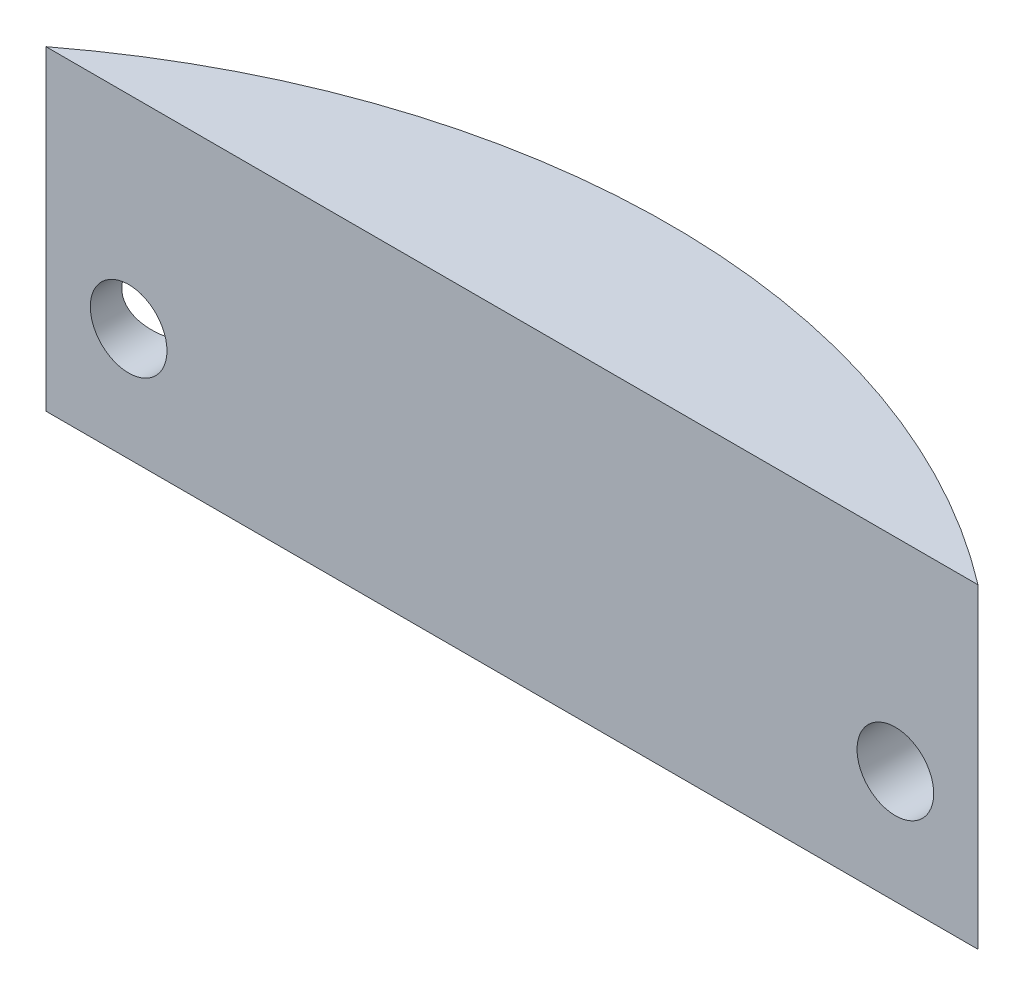
ISO-10303-21;
HEADER;
FILE_DESCRIPTION(('STEP AP214'),'2;1');
FILE_NAME('part.step','',(''),(''),'','','');
FILE_SCHEMA(('AUTOMOTIVE_DESIGN { 1 0 10303 214 1 1 1 1 }'));
ENDSEC;
DATA;
#1=APPLICATION_CONTEXT('core data for automotive mechanical design processes');
#2=APPLICATION_PROTOCOL_DEFINITION('international standard','automotive_design',2000,#1);
#3=PRODUCT_CONTEXT('',#1,'mechanical');
#4=PRODUCT('Part','Part','',(#3));
#5=PRODUCT_RELATED_PRODUCT_CATEGORY('part','',(#4));
#6=PRODUCT_DEFINITION_FORMATION('','',#4);
#7=PRODUCT_DEFINITION_CONTEXT('part definition',#1,'design');
#8=PRODUCT_DEFINITION('design','',#6,#7);
#9=PRODUCT_DEFINITION_SHAPE('','',#8);
#10=(LENGTH_UNIT() NAMED_UNIT(*) SI_UNIT(.MILLI.,.METRE.));
#11=(NAMED_UNIT(*) PLANE_ANGLE_UNIT() SI_UNIT($,.RADIAN.));
#12=(NAMED_UNIT(*) SI_UNIT($,.STERADIAN.) SOLID_ANGLE_UNIT());
#13=UNCERTAINTY_MEASURE_WITH_UNIT(LENGTH_MEASURE(1.E-05),#10,'distance_accuracy_value','');
#14=(GEOMETRIC_REPRESENTATION_CONTEXT(3) GLOBAL_UNCERTAINTY_ASSIGNED_CONTEXT((#13)) GLOBAL_UNIT_ASSIGNED_CONTEXT((#10,
#11,#12)) REPRESENTATION_CONTEXT('',''));
#15=CARTESIAN_POINT('',(0.,0.,0.));
#16=DIRECTION('',(0.,0.,1.));
#17=DIRECTION('',(1.,0.,0.));
#18=AXIS2_PLACEMENT_3D('',#15,#16,#17);
#19=CARTESIAN_POINT('',(0.,35.,0.));
#20=DIRECTION('',(0.,-1.,0.));
#21=DIRECTION('',(0.,0.,-1.));
#22=AXIS2_PLACEMENT_3D('',#19,#20,#21);
#23=CYLINDRICAL_SURFACE('',#22,85.);
#24=CARTESIAN_POINT('',(46.75,12.5,-70.9889956260828));
#25=CARTESIAN_POINT('',(46.7500025103391,12.6055733804831,-70.9889938095292));
#26=CARTESIAN_POINT('',(46.7460629199129,12.7111220879942,-70.9915888269313));
#27=CARTESIAN_POINT('',(46.7303687633322,12.9214171728519,-71.0019206013994));
#28=CARTESIAN_POINT('',(46.7186125228001,13.0261633734325,-71.0096584600955));
#29=CARTESIAN_POINT('',(46.6874445228643,13.2340766647582,-71.0301546458722));
#30=CARTESIAN_POINT('',(46.668027719753,13.3372426685206,-71.0429162805903));
#31=CARTESIAN_POINT('',(46.6218075371733,13.5412225070531,-71.0732567530885));
#32=CARTESIAN_POINT('',(46.5950011637763,13.6420353704389,-71.0908375433621));
#33=CARTESIAN_POINT('',(46.5344959928835,13.8401564477082,-71.1304574844813));
#34=CARTESIAN_POINT('',(46.5008287099537,13.9374783749672,-71.152476245279));
#35=CARTESIAN_POINT('',(46.426939918242,14.1285425951407,-71.2007106448857));
#36=CARTESIAN_POINT('',(46.3867159144849,14.2222835085748,-71.2269278812391));
#37=CARTESIAN_POINT('',(46.2568952248294,14.4973130104781,-71.3113616123959));
#38=CARTESIAN_POINT('',(46.1580944189916,14.6725867671709,-71.3753965885542));
#39=CARTESIAN_POINT('',(45.9325958851346,15.0148744035473,-71.5207364077298));
#40=CARTESIAN_POINT('',(45.8044861104873,15.1805770449768,-71.6029028532981));
#41=CARTESIAN_POINT('',(45.5290133966354,15.4883544250894,-71.7783785881831));
#42=CARTESIAN_POINT('',(45.3816422292548,15.6304190066585,-71.871692638115));
#43=CARTESIAN_POINT('',(45.047032985302,15.9102611494035,-72.081964832143));
#44=CARTESIAN_POINT('',(44.8571713722127,16.0438410947342,-72.2003323462447));
#45=CARTESIAN_POINT('',(44.4619404396592,16.2770381719174,-72.4443919449588));
#46=CARTESIAN_POINT('',(44.2565615911031,16.3766342238647,-72.5700885193339));
#47=CARTESIAN_POINT('',(43.8046818051598,16.553045407798,-72.8438674664753));
#48=CARTESIAN_POINT('',(43.5564938240157,16.6245848525832,-72.9925855534389));
#49=CARTESIAN_POINT('',(43.0520087552415,16.7218347118844,-73.2912730269977));
#50=CARTESIAN_POINT('',(42.7957078080699,16.747522969957,-73.4412429833809));
#51=CARTESIAN_POINT('',(42.2626617747174,16.7522950773593,-73.7493618569819));
#52=CARTESIAN_POINT('',(41.9857577576222,16.7279386618165,-73.9073349968711));
#53=CARTESIAN_POINT('',(41.575204459924,16.6505097486218,-74.1385687195726));
#54=CARTESIAN_POINT('',(41.4390666626052,16.6178497508155,-74.2147400665653));
#55=CARTESIAN_POINT('',(41.1694782131852,16.5388004451056,-74.3646269855335));
#56=CARTESIAN_POINT('',(41.0360262430535,16.4924180558435,-74.438343774276));
#57=CARTESIAN_POINT('',(40.776930903016,16.3874788425904,-74.5805814032693));
#58=CARTESIAN_POINT('',(40.651173335444,16.3293246515013,-74.6491915459362));
#59=CARTESIAN_POINT('',(40.4045905159246,16.2001508424627,-74.7829440423824));
#60=CARTESIAN_POINT('',(40.2837628021927,16.1291377445514,-74.8480881320453));
#61=CARTESIAN_POINT('',(40.0483157944277,15.9744183915941,-74.9743305788064));
#62=CARTESIAN_POINT('',(39.9336948358924,15.8907155627374,-75.0354300215692));
#63=CARTESIAN_POINT('',(39.7120263857735,15.7109280785231,-75.1529819517987));
#64=CARTESIAN_POINT('',(39.6049777758579,15.6148452574593,-75.2094351256577));
#65=CARTESIAN_POINT('',(39.411085127803,15.4219373451122,-75.3112011994177));
#66=CARTESIAN_POINT('',(39.3233104287569,15.3263332842182,-75.3570577460893));
#67=CARTESIAN_POINT('',(39.1559897564547,15.1262325271699,-75.4441340344927));
#68=CARTESIAN_POINT('',(39.0764424154036,15.021737314448,-75.4853545470633));
#69=CARTESIAN_POINT('',(38.9266766088735,14.8046129242818,-75.5626954993855));
#70=CARTESIAN_POINT('',(38.8564512146058,14.691989885275,-75.5988197283556));
#71=CARTESIAN_POINT('',(38.7262818723452,14.4594136777008,-75.6655829801506));
#72=CARTESIAN_POINT('',(38.6663364618932,14.3394615550878,-75.6962227832324));
#73=CARTESIAN_POINT('',(38.564579389133,14.1089617045088,-75.7481092229721));
#74=CARTESIAN_POINT('',(38.5214309136043,13.9991593322737,-75.7700549829375));
#75=CARTESIAN_POINT('',(38.4442227858766,13.7755982291293,-75.809258086549));
#76=CARTESIAN_POINT('',(38.4101619539361,13.6618400139299,-75.8265160387631));
#77=CARTESIAN_POINT('',(38.3515950093934,13.4313278417741,-75.8561549172016));
#78=CARTESIAN_POINT('',(38.3270841963618,13.31457538879,-75.8685382427026));
#79=CARTESIAN_POINT('',(38.287933988995,13.0790099040614,-75.8883034101869));
#80=CARTESIAN_POINT('',(38.2732940267737,12.960196991262,-75.8956855398972));
#81=CARTESIAN_POINT('',(38.2549298709088,12.7319867398707,-75.904943406691));
#82=CARTESIAN_POINT('',(38.2503639977124,12.622673347391,-75.9072437460652));
#83=CARTESIAN_POINT('',(38.2496777760631,12.4039753441922,-75.9075895496761));
#84=CARTESIAN_POINT('',(38.2535601317948,12.2945907218767,-75.9056336515381));
#85=CARTESIAN_POINT('',(38.2697257805101,12.0766658654972,-75.897484608282));
#86=CARTESIAN_POINT('',(38.2820043955458,11.968125195267,-75.8912938226167));
#87=CARTESIAN_POINT('',(38.3148168414223,11.752583329205,-75.8747332598443));
#88=CARTESIAN_POINT('',(38.3353537371059,11.6455827202138,-75.8643619312356));
#89=CARTESIAN_POINT('',(38.3839235100135,11.4361794779726,-75.8397991819505));
#90=CARTESIAN_POINT('',(38.4117869899305,11.3337274512363,-75.8256940461574));
#91=CARTESIAN_POINT('',(38.4748894431101,11.1317152479949,-75.7936945130852));
#92=CARTESIAN_POINT('',(38.5101310200028,11.0321561065112,-75.7757987781289));
#93=CARTESIAN_POINT('',(38.6263847402807,10.738825246129,-75.7166428306594));
#94=CARTESIAN_POINT('',(38.7179701452773,10.5502119937963,-75.6698916134465));
#95=CARTESIAN_POINT('',(38.9301261726218,10.1836895969852,-75.5609688495809));
#96=CARTESIAN_POINT('',(39.0517616787382,10.006574091777,-75.4982272265568));
#97=CARTESIAN_POINT('',(39.3173241090085,9.67543975548904,-75.360270687242));
#98=CARTESIAN_POINT('',(39.4612581718331,9.52142835215604,-75.2850517759187));
#99=CARTESIAN_POINT('',(39.7807092041654,9.22593913734671,-75.1167794462719));
#100=CARTESIAN_POINT('',(39.9579043702788,9.0868482929215,-75.0227289810839));
#101=CARTESIAN_POINT('',(40.3278681431822,8.84024146764574,-74.8245090046742));
#102=CARTESIAN_POINT('',(40.5206434968448,8.73273926042297,-74.7203351055873));
#103=CARTESIAN_POINT('',(40.9396651801528,8.53931034750381,-74.491657589314));
#104=CARTESIAN_POINT('',(41.1672041359549,8.45731641823699,-74.3661961366516));
#105=CARTESIAN_POINT('',(41.6292307994465,8.33328037165107,-74.1085504100224));
#106=CARTESIAN_POINT('',(41.8637216000991,8.2912563210779,-73.9763631243308));
#107=CARTESIAN_POINT('',(42.3598588158566,8.24423965312151,-73.6935029244776));
#108=CARTESIAN_POINT('',(42.621685030315,8.24377150156326,-73.5423830855416));
#109=CARTESIAN_POINT('',(43.1406378455886,8.2904819916057,-73.2391688040395));
#110=CARTESIAN_POINT('',(43.397761192414,8.33769244085158,-73.087073778206));
#111=CARTESIAN_POINT('',(43.9153585535982,8.48308371242869,-72.7773132233053));
#112=CARTESIAN_POINT('',(44.175170043274,8.58404803670237,-72.619832562723));
#113=CARTESIAN_POINT('',(44.6741197477714,8.83749775546,-72.3139581961985));
#114=CARTESIAN_POINT('',(44.9132752407931,8.98993955584664,-72.165556926494));
#115=CARTESIAN_POINT('',(45.3187466439796,9.31088083467914,-71.9114528696849));
#116=CARTESIAN_POINT('',(45.4902252277177,9.47065297779819,-71.8030273720076));
#117=CARTESIAN_POINT('',(45.7285494620606,9.73359401520505,-71.6512993974779));
#118=CARTESIAN_POINT('',(45.8048758849472,9.82517392588655,-71.6025197901351));
#119=CARTESIAN_POINT('',(45.9504427753614,10.0157883914482,-71.5091900646597));
#120=CARTESIAN_POINT('',(46.0196863924408,10.1148195986173,-71.4646380672546));
#121=CARTESIAN_POINT('',(46.1508785678111,10.3208623317487,-71.3799871574381));
#122=CARTESIAN_POINT('',(46.2127538170977,10.4279391342164,-71.339933189618));
#123=CARTESIAN_POINT('',(46.3275562990806,10.6485772911321,-71.265434884678));
#124=CARTESIAN_POINT('',(46.3804885901489,10.7621349308891,-71.2309873768045));
#125=CARTESIAN_POINT('',(46.4765076520077,10.9947785592491,-71.1683744506732));
#126=CARTESIAN_POINT('',(46.5196110753401,11.1138547797797,-71.1401984089599));
#127=CARTESIAN_POINT('',(46.5952823311715,11.3566185839298,-71.090658390489));
#128=CARTESIAN_POINT('',(46.6278555594787,11.4803037695029,-71.0692909250096));
#129=CARTESIAN_POINT('',(46.6862468312837,11.7516081803513,-71.0309494971579));
#130=CARTESIAN_POINT('',(46.7100964076944,11.8998406372211,-71.0152606523568));
#131=CARTESIAN_POINT('',(46.7419701644338,12.1987323473727,-70.9942856942268));
#132=CARTESIAN_POINT('',(46.7499964188041,12.3493912799942,-70.9889982175392));
#133=CARTESIAN_POINT('',(46.75,12.5,-70.9889956260828));
#134=B_SPLINE_CURVE_WITH_KNOTS('',3,(#24,#25,#26,#27,#28,#29,#30,#31,#32,#33,#34,#35,#36,#37,
#38,#39,#40,#41,#42,#43,#44,#45,#46,#47,#48,#49,#50,#51,#52,#53,#54,#55,#56,#57,#58,#59,#60,#61,
#62,#63,#64,#65,#66,#67,#68,#69,#70,#71,#72,#73,#74,#75,#76,#77,#78,#79,#80,#81,#82,#83,#84,#85,
#86,#87,#88,#89,#90,#91,#92,#93,#94,#95,#96,#97,#98,#99,#100,#101,#102,#103,#104,#105,#106,#107,
#108,#109,#110,#111,#112,#113,#114,#115,#116,#117,#118,#119,#120,#121,#122,#123,#124,#125,#126,
#127,#128,#129,#130,#131,#132,#133),.UNSPECIFIED.,.T.,.F.,(4,2,2,2,2,2,2,2,2,2,2,2,2,2,2,2,2,2,
2,2,2,2,2,2,2,2,2,2,2,2,2,2,2,2,2,2,2,2,2,2,2,2,2,2,2,2,2,2,2,2,2,2,2,2,4),(0.,
0.316572891647738,0.633213617140965,0.950063167451003,1.26704128041579,1.58259495463857,
1.89826898542045,2.52905254561162,3.2015199110679,3.87427548912098,4.65296702842401,
5.43214070878143,6.32245296215925,7.21319532039165,8.16721330769431,8.64484525961358,
9.12223680526036,9.58544538546126,10.0484197526302,10.5112693400041,10.9740504275098,
11.386419049215,11.7987190042314,12.2107107694324,12.6226438748316,12.9821637054846,
13.3416368411901,13.7009328234163,14.0602081329953,14.3881054549562,14.7161077486616,
15.0439274457149,15.3718689168384,15.692808958109,16.0138624462345,16.6553927858674,
17.3241409186226,17.9931035888382,18.7224629907632,19.4521399457458,20.2661998923606,
21.0806276267932,21.9836296232775,22.8872344342812,23.8429710635457,24.7979003412287,
25.5691678977041,25.9551939230566,26.3410475388764,26.73046602844,27.119663509859,
27.508196612026,27.8965303080644,28.348205611936,28.7998217085451),.UNSPECIFIED.);
#135=CARTESIAN_POINT('',(46.75,12.5,-70.9889956260828));
#136=VERTEX_POINT('',#135);
#137=EDGE_CURVE('E105',#136,#136,#134,.T.);
#138=ORIENTED_EDGE('',*,*,#137,.T.);
#139=EDGE_LOOP('',(#138));
#140=FACE_BOUND('',#139,.T.);
#141=CARTESIAN_POINT('',(-38.25,12.5,-75.9074271728399));
#142=CARTESIAN_POINT('',(-38.24999729797,12.6098005267454,-75.9074283433082));
#143=CARTESIAN_POINT('',(-38.2542574593415,12.7195729289884,-75.9052822231198));
#144=CARTESIAN_POINT('',(-38.2712416667276,12.9383289898238,-75.8967203444061));
#145=CARTESIAN_POINT('',(-38.283967384878,13.0473124882902,-75.8903037423654));
#146=CARTESIAN_POINT('',(-38.3177441602042,13.2636989663055,-75.873255086363));
#147=CARTESIAN_POINT('',(-38.3387994615824,13.3711011111198,-75.8626208833849));
#148=CARTESIAN_POINT('',(-38.3889958651583,13.5835420395048,-75.837232195977));
#149=CARTESIAN_POINT('',(-38.418140048907,13.6885799058575,-75.8224761412675));
#150=CARTESIAN_POINT('',(-38.4840938981985,13.895251564553,-75.7890221494819));
#151=CARTESIAN_POINT('',(-38.520882225092,13.996893937534,-75.7703351837981));
#152=CARTESIAN_POINT('',(-38.6017708472467,14.1964437200465,-75.7291578288326));
#153=CARTESIAN_POINT('',(-38.6458738554006,14.2943497271881,-75.7066660283395));
#154=CARTESIAN_POINT('',(-38.7884607450747,14.5814735072525,-75.6337670325887));
#155=CARTESIAN_POINT('',(-38.897292405792,14.764313197553,-75.5779009654018));
#156=CARTESIAN_POINT('',(-39.1430397936089,15.1155533861087,-75.4509259947205));
#157=CARTESIAN_POINT('',(-39.2808887463548,15.2831075487844,-75.379305659579));
#158=CARTESIAN_POINT('',(-39.577044689303,15.5926918291922,-75.2242345852538));
#159=CARTESIAN_POINT('',(-39.7353583780276,15.7347135530891,-75.1407799715999));
#160=CARTESIAN_POINT('',(-40.0845501181322,16.0045075883184,-74.9551312022874));
#161=CARTESIAN_POINT('',(-40.2771022184484,16.1293914855233,-74.8518956532581));
#162=CARTESIAN_POINT('',(-40.675544458341,16.3451607507986,-74.6361272652697));
#163=CARTESIAN_POINT('',(-40.8814408624616,16.4360300129147,-74.5235900526766));
#164=CARTESIAN_POINT('',(-41.3261305861512,16.5922339219505,-74.2780092703513));
#165=CARTESIAN_POINT('',(-41.5659469244095,16.6533145609483,-74.1441098099756));
#166=CARTESIAN_POINT('',(-42.049517187486,16.7331662523689,-73.8709372679207));
#167=CARTESIAN_POINT('',(-42.2932727981115,16.751918680184,-73.7316618481972));
#168=CARTESIAN_POINT('',(-42.8032182844576,16.7475674112539,-73.4369079940806));
#169=CARTESIAN_POINT('',(-43.0692405223702,16.7201369044043,-73.2811903152702));
#170=CARTESIAN_POINT('',(-43.5924909272572,16.6158482601502,-72.9711406142404));
#171=CARTESIAN_POINT('',(-43.8497129179966,16.538956129552,-72.8168096190597));
#172=CARTESIAN_POINT('',(-44.356600469458,16.3331233256172,-72.5091907027447));
#173=CARTESIAN_POINT('',(-44.6057270628336,16.2025306990742,-72.3561096187499));
#174=CARTESIAN_POINT('',(-45.0782045917146,15.8904788564047,-72.0626994168726));
#175=CARTESIAN_POINT('',(-45.301588397428,15.7090855451364,-71.9223540868904));
#176=CARTESIAN_POINT('',(-45.6638760534475,15.3463263228305,-71.6927129363705));
#177=CARTESIAN_POINT('',(-45.8102567909325,15.1751330214948,-71.5991997160567));
#178=CARTESIAN_POINT('',(-46.0101684817689,14.8987864164834,-71.4707681677303));
#179=CARTESIAN_POINT('',(-46.0735452217872,14.8033798441372,-71.4299202101281));
#180=CARTESIAN_POINT('',(-46.1930544984966,14.6064419796767,-71.3526927932265));
#181=CARTESIAN_POINT('',(-46.2491901472363,14.5049133463948,-71.3163114146242));
#182=CARTESIAN_POINT('',(-46.353930776273,14.2954225739479,-71.2482774409694));
#183=CARTESIAN_POINT('',(-46.4024724750172,14.187415782647,-71.2166646539705));
#184=CARTESIAN_POINT('',(-46.4907524935557,13.9664706457254,-71.1590662658071));
#185=CARTESIAN_POINT('',(-46.5304953215699,13.8535348612164,-71.1330777831088));
#186=CARTESIAN_POINT('',(-46.6005400883728,13.623613330813,-71.0872099520428));
#187=CARTESIAN_POINT('',(-46.6308460777142,13.5066293465428,-71.0673279826405));
#188=CARTESIAN_POINT('',(-46.6814902075039,13.2696210534528,-71.0340720702767));
#189=CARTESIAN_POINT('',(-46.701829908008,13.1495972235653,-71.0206971087544));
#190=CARTESIAN_POINT('',(-46.7302066839354,12.9232506898363,-71.0020283440657));
#191=CARTESIAN_POINT('',(-46.7394888265486,12.8171493373862,-70.9959169403867));
#192=CARTESIAN_POINT('',(-46.75005256953,12.6043798843605,-70.9889613021891));
#193=CARTESIAN_POINT('',(-46.7513348278591,12.4977118311162,-70.988116634501));
#194=CARTESIAN_POINT('',(-46.7458798685604,12.2847050731163,-70.9917088498357));
#195=CARTESIAN_POINT('',(-46.7391451166177,12.1783662771781,-70.9961441089819));
#196=CARTESIAN_POINT('',(-46.717764710502,11.9668377378343,-71.010214923169));
#197=CARTESIAN_POINT('',(-46.7031191410302,11.8616479821383,-71.0198504225311));
#198=CARTESIAN_POINT('',(-46.6672418165038,11.6594680267757,-71.0434301838183));
#199=CARTESIAN_POINT('',(-46.646456987694,11.5623640245186,-71.0570818668391));
#200=CARTESIAN_POINT('',(-46.5983520009899,11.3704821954848,-71.0886377193037));
#201=CARTESIAN_POINT('',(-46.5710296257799,11.2757051699916,-71.1065433315224));
#202=CARTESIAN_POINT('',(-46.479728683041,10.9957732615772,-71.1662851937441));
#203=CARTESIAN_POINT('',(-46.406386205301,10.8148514774999,-71.214166344767));
#204=CARTESIAN_POINT('',(-46.2326370716394,10.4574852765438,-71.3270957394877));
#205=CARTESIAN_POINT('',(-46.1308398086146,10.2820057941901,-71.3930208858126));
#206=CARTESIAN_POINT('',(-45.9064179758262,9.95070955953445,-71.5375328090603));
#207=CARTESIAN_POINT('',(-45.7837839973031,9.79490174556402,-71.6161253050611));
#208=CARTESIAN_POINT('',(-45.5030758294136,9.48442236864906,-71.7948563850543));
#209=CARTESIAN_POINT('',(-45.3424448967369,9.33291795937868,-71.8964713974262));
#210=CARTESIAN_POINT('',(-45.0036728172609,9.05882769819809,-72.1090111859902));
#211=CARTESIAN_POINT('',(-44.8255217700229,8.93625833175383,-72.2199412207726));
#212=CARTESIAN_POINT('',(-44.4268944605722,8.70384556117098,-72.4659506702388));
#213=CARTESIAN_POINT('',(-44.204157328121,8.59899465119635,-72.6020927681351));
#214=CARTESIAN_POINT('',(-43.7464263588397,8.42955278616093,-72.878816045498));
#215=CARTESIAN_POINT('',(-43.5114256959037,8.36498451784903,-73.0193996796518));
#216=CARTESIAN_POINT('',(-43.007965774359,8.27187181089906,-73.3171843297481));
#217=CARTESIAN_POINT('',(-42.7386832518419,8.24810859923792,-73.4745014925243));
#218=CARTESIAN_POINT('',(-42.1984114016849,8.25212417656418,-73.7861176549655));
#219=CARTESIAN_POINT('',(-41.9274215571738,8.27991940324898,-73.9404156762282));
#220=CARTESIAN_POINT('',(-41.5235793305255,8.36134473376419,-74.1674931894405));
#221=CARTESIAN_POINT('',(-41.3881900761721,8.39560640818621,-74.2431228662311));
#222=CARTESIAN_POINT('',(-41.1202259321586,8.47777010876051,-74.3918706173793));
#223=CARTESIAN_POINT('',(-40.9876497683951,8.52566581169996,-74.4649898384648));
#224=CARTESIAN_POINT('',(-40.7264851111307,8.63513203372387,-74.6081471142041));
#225=CARTESIAN_POINT('',(-40.5978977065529,8.69670625021684,-74.6781843296234));
#226=CARTESIAN_POINT('',(-40.3461381379443,8.83341056565803,-74.8145013149399));
#227=CARTESIAN_POINT('',(-40.2229627845586,8.90853254387737,-74.8807833046664));
#228=CARTESIAN_POINT('',(-39.9927280635595,9.06576370308859,-75.0039826049099));
#229=CARTESIAN_POINT('',(-39.8851607395512,9.1468727078892,-75.0612271975384));
#230=CARTESIAN_POINT('',(-39.6770322212629,9.32011461684943,-75.1714505103196));
#231=CARTESIAN_POINT('',(-39.5764670903107,9.41224124635529,-75.224431630073));
#232=CARTESIAN_POINT('',(-39.3835542125645,9.60706838016451,-75.3256100035762));
#233=CARTESIAN_POINT('',(-39.2912039676365,9.70976564931902,-75.3738087121681));
#234=CARTESIAN_POINT('',(-39.1159668736608,9.92510586320766,-75.4648983913647));
#235=CARTESIAN_POINT('',(-39.0330783677231,10.0377470604679,-75.5077902913805));
#236=CARTESIAN_POINT('',(-38.8878519948712,10.2572461527558,-75.5826750991265));
#237=CARTESIAN_POINT('',(-38.8242409832841,10.3630275185602,-75.6153603715352));
#238=CARTESIAN_POINT('',(-38.7059967174975,10.5807857013825,-75.6759554468766));
#239=CARTESIAN_POINT('',(-38.6513619733277,10.6927614860561,-75.7038660423894));
#240=CARTESIAN_POINT('',(-38.551882517422,10.9218871916712,-75.754573934034));
#241=CARTESIAN_POINT('',(-38.5070227886186,11.0390288387278,-75.7773790750233));
#242=CARTESIAN_POINT('',(-38.4276481972524,11.2776024032276,-75.8176617419642));
#243=CARTESIAN_POINT('',(-38.393129871838,11.3990328692864,-75.8351410513209));
#244=CARTESIAN_POINT('',(-38.3263691235785,11.681415254714,-75.8689082682501));
#245=CARTESIAN_POINT('',(-38.2977900648501,11.8434754988322,-75.8833296646629));
#246=CARTESIAN_POINT('',(-38.2596086732324,12.1703785004088,-75.9025876615397));
#247=CARTESIAN_POINT('',(-38.2500040549716,12.3352209203565,-75.907425416303));
#248=CARTESIAN_POINT('',(-38.25,12.5,-75.9074271728399));
#249=B_SPLINE_CURVE_WITH_KNOTS('',3,(#141,#142,#143,#144,#145,#146,#147,#148,#149,#150,#151,
#152,#153,#154,#155,#156,#157,#158,#159,#160,#161,#162,#163,#164,#165,#166,#167,#168,#169,#170,
#171,#172,#173,#174,#175,#176,#177,#178,#179,#180,#181,#182,#183,#184,#185,#186,#187,#188,#189,
#190,#191,#192,#193,#194,#195,#196,#197,#198,#199,#200,#201,#202,#203,#204,#205,#206,#207,#208,
#209,#210,#211,#212,#213,#214,#215,#216,#217,#218,#219,#220,#221,#222,#223,#224,#225,#226,#227,
#228,#229,#230,#231,#232,#233,#234,#235,#236,#237,#238,#239,#240,#241,#242,#243,#244,#245,#246,
#247,#248),.UNSPECIFIED.,.T.,.F.,(4,2,2,2,2,2,2,2,2,2,2,2,2,2,2,2,2,2,2,2,2,2,2,2,2,2,2,2,2,2,2,
2,2,2,2,2,2,2,2,2,2,2,2,2,2,2,2,2,2,2,2,2,2,4),(0.,0.329249817211403,0.658564687908538,
0.988047572156987,1.31765614932018,1.64635669520044,1.97517942434118,2.63214338960483,
3.31484573848571,3.9977721181986,4.74968137596767,5.50194621429758,6.34258816276764,
7.18359992551801,8.10785821809945,9.03275239978382,9.98852443718223,10.9430622287766,
11.6714809484677,12.0359092818003,12.400180466944,12.7673417616138,13.1343144986427,
13.5011295029781,13.867887070201,14.187514523086,14.5071156874456,14.8266185817186,
15.1461180551405,15.4464846708851,15.7469533056405,16.3473866367032,16.9848651728531,
17.6226323293485,18.3490326480563,19.075845832982,19.9163893686051,20.7574058629457,
21.6915586121925,22.6260092362388,23.1019506239583,23.5776716374012,24.0535213987403,
24.5290868710337,24.9676057388042,25.4058760442047,25.8440126133825,26.2820723403027,
26.6646095630471,27.0470832241601,27.4289650935751,27.8107189453457,28.3048879552127,
28.7989974413966),.UNSPECIFIED.);
#250=CARTESIAN_POINT('',(-38.25,12.5,-75.9074271728399));
#251=VERTEX_POINT('',#250);
#252=EDGE_CURVE('E69',#251,#251,#249,.T.);
#253=ORIENTED_EDGE('',*,*,#252,.T.);
#254=EDGE_LOOP('',(#253));
#255=FACE_BOUND('',#254,.T.);
#256=CARTESIAN_POINT('',(0.,0.,0.));
#257=DIRECTION('',(0.,1.,0.));
#258=DIRECTION('',(0.,0.,-1.));
#259=AXIS2_PLACEMENT_3D('',#256,#257,#258);
#260=CIRCLE('',#259,85.);
#261=CARTESIAN_POINT('',(51.6599457994296,0.,-67.5));
#262=VERTEX_POINT('',#261);
#263=CARTESIAN_POINT('',(-51.6599457994296,0.,-67.5));
#264=VERTEX_POINT('',#263);
#265=EDGE_CURVE('E65',#262,#264,#260,.T.);
#266=ORIENTED_EDGE('',*,*,#265,.T.);
#267=DIRECTION('',(0.,-1.,0.));
#268=VECTOR('',#267,1.);
#269=CARTESIAN_POINT('',(-51.6599457994296,35.,-67.5));
#270=LINE('',#269,#268);
#271=CARTESIAN_POINT('',(-51.6599457994296,35.,-67.5));
#272=VERTEX_POINT('',#271);
#273=EDGE_CURVE('E11',#272,#264,#270,.T.);
#274=ORIENTED_EDGE('',*,*,#273,.F.);
#275=CARTESIAN_POINT('',(0.,35.,0.));
#276=DIRECTION('',(0.,1.,0.));
#277=DIRECTION('',(0.,0.,-1.));
#278=AXIS2_PLACEMENT_3D('',#275,#276,#277);
#279=CIRCLE('',#278,85.);
#280=CARTESIAN_POINT('',(51.6599457994296,35.,-67.5));
#281=VERTEX_POINT('',#280);
#282=EDGE_CURVE('E64',#281,#272,#279,.T.);
#283=ORIENTED_EDGE('',*,*,#282,.F.);
#284=DIRECTION('',(0.,-1.,0.));
#285=VECTOR('',#284,1.);
#286=CARTESIAN_POINT('',(51.6599457994296,35.,-67.5));
#287=LINE('',#286,#285);
#288=EDGE_CURVE('E42',#281,#262,#287,.T.);
#289=ORIENTED_EDGE('',*,*,#288,.T.);
#290=EDGE_LOOP('',(#266,#274,#283,#289));
#291=FACE_BOUND('',#290,.T.);
#292=ADVANCED_FACE('F33',(#140,#255,#291),#23,.T.);
#293=CARTESIAN_POINT('',(-51.6599457994296,35.,-67.5));
#294=DIRECTION('',(0.,0.,-1.));
#295=DIRECTION('',(-1.,0.,0.));
#296=AXIS2_PLACEMENT_3D('',#293,#294,#295);
#297=PLANE('',#296);
#298=CARTESIAN_POINT('',(42.5,12.5,-67.5));
#299=DIRECTION('',(0.,0.,1.));
#300=DIRECTION('',(1.,0.,0.));
#301=AXIS2_PLACEMENT_3D('',#298,#299,#300);
#302=CIRCLE('',#301,4.25000000000001);
#303=CARTESIAN_POINT('',(46.75,12.5,-67.5));
#304=VERTEX_POINT('',#303);
#305=EDGE_CURVE('E102',#304,#304,#302,.T.);
#306=ORIENTED_EDGE('',*,*,#305,.F.);
#307=EDGE_LOOP('',(#306));
#308=FACE_BOUND('',#307,.T.);
#309=CARTESIAN_POINT('',(-42.5,12.5,-67.5));
#310=DIRECTION('',(0.,0.,1.));
#311=DIRECTION('',(1.,0.,0.));
#312=AXIS2_PLACEMENT_3D('',#309,#310,#311);
#313=CIRCLE('',#312,4.25000000000001);
#314=CARTESIAN_POINT('',(-38.25,12.5,-67.5));
#315=VERTEX_POINT('',#314);
#316=EDGE_CURVE('E72',#315,#315,#313,.T.);
#317=ORIENTED_EDGE('',*,*,#316,.F.);
#318=EDGE_LOOP('',(#317));
#319=FACE_BOUND('',#318,.T.);
#320=DIRECTION('',(1.,0.,0.));
#321=VECTOR('',#320,1.);
#322=CARTESIAN_POINT('',(-51.6599457994296,0.,-67.5));
#323=LINE('',#322,#321);
#324=EDGE_CURVE('E57',#264,#262,#323,.T.);
#325=ORIENTED_EDGE('',*,*,#324,.T.);
#326=ORIENTED_EDGE('',*,*,#288,.F.);
#327=DIRECTION('',(1.,0.,0.));
#328=VECTOR('',#327,1.);
#329=CARTESIAN_POINT('',(-51.6599457994296,35.,-67.5));
#330=LINE('',#329,#328);
#331=EDGE_CURVE('E49',#272,#281,#330,.T.);
#332=ORIENTED_EDGE('',*,*,#331,.F.);
#333=ORIENTED_EDGE('',*,*,#273,.T.);
#334=EDGE_LOOP('',(#325,#326,#332,#333));
#335=FACE_BOUND('',#334,.T.);
#336=ADVANCED_FACE('F60',(#308,#319,#335),#297,.F.);
#337=CARTESIAN_POINT('',(0.,35.,0.));
#338=DIRECTION('',(0.,-1.,0.));
#339=DIRECTION('',(0.,0.,-1.));
#340=AXIS2_PLACEMENT_3D('',#337,#338,#339);
#341=PLANE('',#340);
#342=ORIENTED_EDGE('',*,*,#282,.T.);
#343=ORIENTED_EDGE('',*,*,#331,.T.);
#344=EDGE_LOOP('',(#342,#343));
#345=FACE_BOUND('',#344,.T.);
#346=ADVANCED_FACE('F89',(#345),#341,.F.);
#347=CARTESIAN_POINT('',(0.,0.,0.));
#348=DIRECTION('',(0.,-1.,0.));
#349=DIRECTION('',(0.,0.,-1.));
#350=AXIS2_PLACEMENT_3D('',#347,#348,#349);
#351=PLANE('',#350);
#352=ORIENTED_EDGE('',*,*,#265,.F.);
#353=ORIENTED_EDGE('',*,*,#324,.F.);
#354=EDGE_LOOP('',(#352,#353));
#355=FACE_BOUND('',#354,.T.);
#356=ADVANCED_FACE('F68',(#355),#351,.T.);
#357=CARTESIAN_POINT('',(-42.5,12.5,-77.5));
#358=DIRECTION('',(0.,0.,1.));
#359=DIRECTION('',(1.,0.,0.));
#360=AXIS2_PLACEMENT_3D('',#357,#358,#359);
#361=CYLINDRICAL_SURFACE('',#360,4.25000000000001);
#362=ORIENTED_EDGE('',*,*,#316,.T.);
#363=EDGE_LOOP('',(#362));
#364=FACE_BOUND('',#363,.T.);
#365=ORIENTED_EDGE('',*,*,#252,.F.);
#366=EDGE_LOOP('',(#365));
#367=FACE_BOUND('',#366,.T.);
#368=ADVANCED_FACE('F81',(#364,#367),#361,.F.);
#369=CARTESIAN_POINT('',(42.5,12.5,-77.5));
#370=DIRECTION('',(0.,0.,1.));
#371=DIRECTION('',(1.,0.,0.));
#372=AXIS2_PLACEMENT_3D('',#369,#370,#371);
#373=CYLINDRICAL_SURFACE('',#372,4.25000000000001);
#374=ORIENTED_EDGE('',*,*,#305,.T.);
#375=EDGE_LOOP('',(#374));
#376=FACE_BOUND('',#375,.T.);
#377=ORIENTED_EDGE('',*,*,#137,.F.);
#378=EDGE_LOOP('',(#377));
#379=FACE_BOUND('',#378,.T.);
#380=ADVANCED_FACE('F86',(#376,#379),#373,.F.);
#381=CLOSED_SHELL('',(#292,#336,#346,#356,#368,#380));
#382=MANIFOLD_SOLID_BREP('B2',#381);
#383=ADVANCED_BREP_SHAPE_REPRESENTATION('',(#18,#382),#14);
#384=SHAPE_DEFINITION_REPRESENTATION(#9,#383);
ENDSEC;
END-ISO-10303-21;
